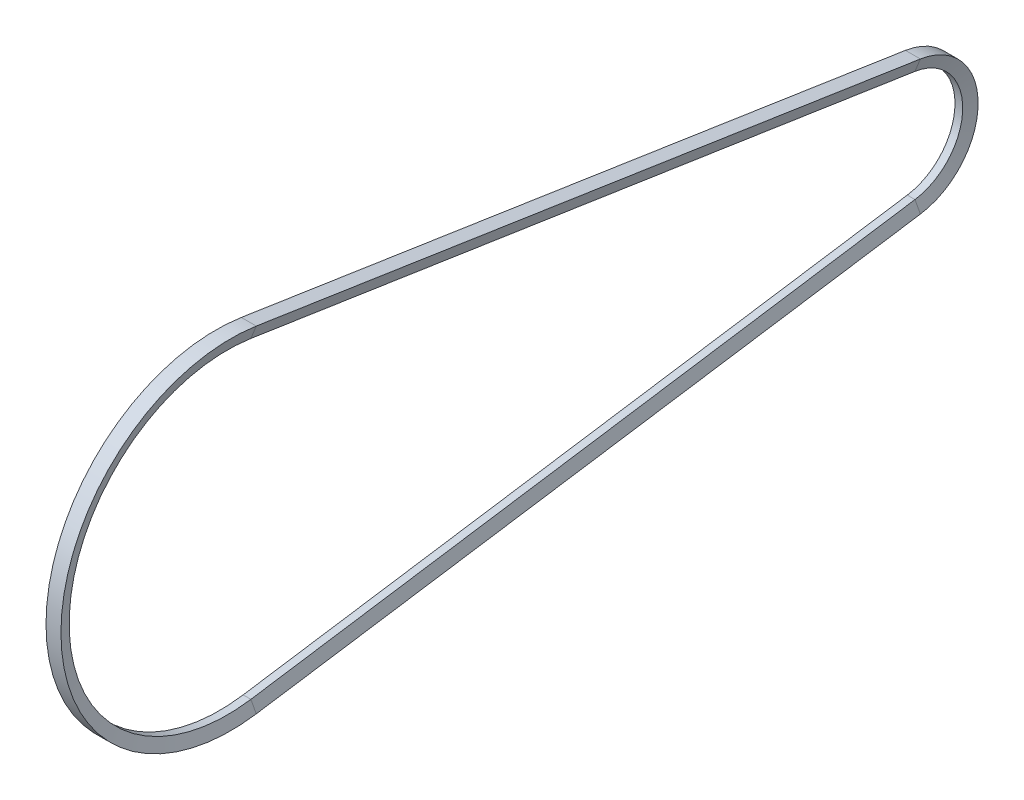
ISO-10303-21;
HEADER;
FILE_DESCRIPTION(('STEP AP214'),'2;1');
FILE_NAME('part.step','',(''),(''),'','','');
FILE_SCHEMA(('AUTOMOTIVE_DESIGN { 1 0 10303 214 1 1 1 1 }'));
ENDSEC;
DATA;
#1=APPLICATION_CONTEXT('core data for automotive mechanical design processes');
#2=APPLICATION_PROTOCOL_DEFINITION('international standard','automotive_design',2000,#1);
#3=PRODUCT_CONTEXT('',#1,'mechanical');
#4=PRODUCT('Part','Part','',(#3));
#5=PRODUCT_RELATED_PRODUCT_CATEGORY('part','',(#4));
#6=PRODUCT_DEFINITION_FORMATION('','',#4);
#7=PRODUCT_DEFINITION_CONTEXT('part definition',#1,'design');
#8=PRODUCT_DEFINITION('design','',#6,#7);
#9=PRODUCT_DEFINITION_SHAPE('','',#8);
#10=(LENGTH_UNIT() NAMED_UNIT(*) SI_UNIT(.MILLI.,.METRE.));
#11=(NAMED_UNIT(*) PLANE_ANGLE_UNIT() SI_UNIT($,.RADIAN.));
#12=(NAMED_UNIT(*) SI_UNIT($,.STERADIAN.) SOLID_ANGLE_UNIT());
#13=UNCERTAINTY_MEASURE_WITH_UNIT(LENGTH_MEASURE(1.E-05),#10,'distance_accuracy_value','');
#14=(GEOMETRIC_REPRESENTATION_CONTEXT(3) GLOBAL_UNCERTAINTY_ASSIGNED_CONTEXT((#13)) GLOBAL_UNIT_ASSIGNED_CONTEXT((#10,
#11,#12)) REPRESENTATION_CONTEXT('',''));
#15=CARTESIAN_POINT('',(0.,0.,0.));
#16=DIRECTION('',(0.,0.,1.));
#17=DIRECTION('',(1.,0.,0.));
#18=AXIS2_PLACEMENT_3D('',#15,#16,#17);
#19=CARTESIAN_POINT('',(2.84014307130969,40.8327316622341,-506.194999999998));
#20=DIRECTION('',(0.,-0.988685996664259,0.15));
#21=DIRECTION('',(0.,-0.15,-0.988685996664259));
#22=AXIS2_PLACEMENT_3D('',#19,#20,#21);
#23=PLANE('',#22);
#24=DIRECTION('',(1.,0.,0.));
#25=VECTOR('',#24,1.);
#26=CARTESIAN_POINT('',(2.84014307130969,40.8327316622341,-506.194999999998));
#27=LINE('',#26,#25);
#28=CARTESIAN_POINT('',(-2.84014307130969,40.8327316622341,-506.194999999998));
#29=VERTEX_POINT('',#28);
#30=CARTESIAN_POINT('',(2.84014307130969,40.8327316622341,-506.194999999998));
#31=VERTEX_POINT('',#30);
#32=EDGE_CURVE('E157',#29,#31,#27,.T.);
#33=ORIENTED_EDGE('',*,*,#32,.T.);
#34=DIRECTION('',(0.,0.15,0.988685996664259));
#35=VECTOR('',#34,1.);
#36=CARTESIAN_POINT('',(2.84014307130969,40.8327316622341,-506.194999999998));
#37=LINE('',#36,#35);
#38=CARTESIAN_POINT('',(2.84014307130969,114.984181412054,-17.4449999999985));
#39=VERTEX_POINT('',#38);
#40=EDGE_CURVE('E38',#31,#39,#37,.T.);
#41=ORIENTED_EDGE('',*,*,#40,.T.);
#42=DIRECTION('',(1.,0.,0.));
#43=VECTOR('',#42,1.);
#44=CARTESIAN_POINT('',(2.84014307130969,114.984181412054,-17.4449999999985));
#45=LINE('',#44,#43);
#46=CARTESIAN_POINT('',(-2.84014307130969,114.984181412054,-17.4449999999985));
#47=VERTEX_POINT('',#46);
#48=EDGE_CURVE('E178',#47,#39,#45,.T.);
#49=ORIENTED_EDGE('',*,*,#48,.F.);
#50=DIRECTION('',(0.,0.15,0.988685996664259));
#51=VECTOR('',#50,1.);
#52=CARTESIAN_POINT('',(-2.84014307130969,40.8327316622341,-506.194999999998));
#53=LINE('',#52,#51);
#54=EDGE_CURVE('E11',#29,#47,#53,.T.);
#55=ORIENTED_EDGE('',*,*,#54,.F.);
#56=EDGE_LOOP('',(#33,#41,#49,#55));
#57=FACE_BOUND('',#56,.T.);
#58=ADVANCED_FACE('F30',(#57),#23,.T.);
#59=CARTESIAN_POINT('',(5.5,49.4342998332132,-507.499999999998));
#60=DIRECTION('',(0.956304755963036,-0.289063810280224,0.04385575570841));
#61=DIRECTION('',(0.289342194072153,0.95722572820078,0.));
#62=AXIS2_PLACEMENT_3D('',#59,#60,#61);
#63=PLANE('',#62);
#64=DIRECTION('',(0.292371704722734,0.945485120764089,-0.143445713394439));
#65=VECTOR('',#64,1.);
#66=CARTESIAN_POINT('',(5.5,49.4342998332132,-507.499999999998));
#67=LINE('',#66,#65);
#68=CARTESIAN_POINT('',(5.5,49.4342998332132,-507.499999999998));
#69=VERTEX_POINT('',#68);
#70=EDGE_CURVE('E154',#31,#69,#67,.T.);
#71=ORIENTED_EDGE('',*,*,#70,.T.);
#72=DIRECTION('',(0.,0.15,0.988685996664259));
#73=VECTOR('',#72,1.);
#74=CARTESIAN_POINT('',(5.5,49.4342998332132,-507.499999999998));
#75=LINE('',#74,#73);
#76=CARTESIAN_POINT('',(5.5,123.585749583033,-18.7499999999983));
#77=VERTEX_POINT('',#76);
#78=EDGE_CURVE('E183',#69,#77,#75,.T.);
#79=ORIENTED_EDGE('',*,*,#78,.T.);
#80=DIRECTION('',(0.292371704722734,0.945485120764089,-0.143445713394439));
#81=VECTOR('',#80,1.);
#82=CARTESIAN_POINT('',(5.5,123.585749583033,-18.7499999999983));
#83=LINE('',#82,#81);
#84=EDGE_CURVE('E176',#39,#77,#83,.T.);
#85=ORIENTED_EDGE('',*,*,#84,.F.);
#86=ORIENTED_EDGE('',*,*,#40,.F.);
#87=EDGE_LOOP('',(#71,#79,#85,#86));
#88=FACE_BOUND('',#87,.T.);
#89=ADVANCED_FACE('F207',(#88),#63,.T.);
#90=CARTESIAN_POINT('',(-5.5,49.4342998332132,-507.499999999998));
#91=DIRECTION('',(0.,0.988685996664259,-0.15));
#92=DIRECTION('',(0.,0.15,0.988685996664259));
#93=AXIS2_PLACEMENT_3D('',#90,#91,#92);
#94=PLANE('',#93);
#95=DIRECTION('',(-1.,0.,0.));
#96=VECTOR('',#95,1.);
#97=CARTESIAN_POINT('',(-5.5,49.4342998332132,-507.499999999998));
#98=LINE('',#97,#96);
#99=CARTESIAN_POINT('',(-5.5,49.4342998332132,-507.499999999998));
#100=VERTEX_POINT('',#99);
#101=EDGE_CURVE('E151',#69,#100,#98,.T.);
#102=ORIENTED_EDGE('',*,*,#101,.T.);
#103=DIRECTION('',(0.,0.15,0.988685996664259));
#104=VECTOR('',#103,1.);
#105=CARTESIAN_POINT('',(-5.5,49.4342998332132,-507.499999999998));
#106=LINE('',#105,#104);
#107=CARTESIAN_POINT('',(-5.5,123.585749583033,-18.7499999999983));
#108=VERTEX_POINT('',#107);
#109=EDGE_CURVE('E180',#100,#108,#106,.T.);
#110=ORIENTED_EDGE('',*,*,#109,.T.);
#111=DIRECTION('',(-1.,0.,0.));
#112=VECTOR('',#111,1.);
#113=CARTESIAN_POINT('',(-5.5,123.585749583033,-18.7499999999983));
#114=LINE('',#113,#112);
#115=EDGE_CURVE('E173',#77,#108,#114,.T.);
#116=ORIENTED_EDGE('',*,*,#115,.F.);
#117=ORIENTED_EDGE('',*,*,#78,.F.);
#118=EDGE_LOOP('',(#102,#110,#116,#117));
#119=FACE_BOUND('',#118,.T.);
#120=ADVANCED_FACE('F206',(#119),#94,.T.);
#121=CARTESIAN_POINT('',(-2.84014307130969,40.8327316622341,-506.194999999998));
#122=DIRECTION('',(-0.956304755963036,-0.289063810280224,0.04385575570841));
#123=DIRECTION('',(0.289342194072153,-0.95722572820078,0.));
#124=AXIS2_PLACEMENT_3D('',#121,#122,#123);
#125=PLANE('',#124);
#126=DIRECTION('',(0.292371704722734,-0.945485120764089,0.143445713394439));
#127=VECTOR('',#126,1.);
#128=CARTESIAN_POINT('',(-2.84014307130969,40.8327316622341,-506.194999999998));
#129=LINE('',#128,#127);
#130=EDGE_CURVE('E109',#100,#29,#129,.T.);
#131=ORIENTED_EDGE('',*,*,#130,.T.);
#132=ORIENTED_EDGE('',*,*,#54,.T.);
#133=DIRECTION('',(0.292371704722734,-0.945485120764089,0.143445713394439));
#134=VECTOR('',#133,1.);
#135=CARTESIAN_POINT('',(-2.84014307130969,114.984181412054,-17.4449999999985));
#136=LINE('',#135,#134);
#137=EDGE_CURVE('E122',#108,#47,#136,.T.);
#138=ORIENTED_EDGE('',*,*,#137,.F.);
#139=ORIENTED_EDGE('',*,*,#109,.F.);
#140=EDGE_LOOP('',(#131,#132,#138,#139));
#141=FACE_BOUND('',#140,.T.);
#142=ADVANCED_FACE('F240',(#141),#125,.T.);
#143=CARTESIAN_POINT('',(0.,0.,-500.));
#144=DIRECTION('',(1.,0.,0.));
#145=DIRECTION('',(0.,0.,-1.));
#146=AXIS2_PLACEMENT_3D('',#143,#144,#145);
#147=CYLINDRICAL_SURFACE('',#146,41.2999999999999);
#148=DIRECTION('',(1.,0.,0.));
#149=VECTOR('',#148,1.);
#150=CARTESIAN_POINT('',(2.84014307130969,-40.8327316622336,-506.195000000002));
#151=LINE('',#150,#149);
#152=CARTESIAN_POINT('',(-2.84014307130969,-40.8327316622336,-506.195000000002));
#153=VERTEX_POINT('',#152);
#154=CARTESIAN_POINT('',(2.84014307130969,-40.8327316622336,-506.195000000002));
#155=VERTEX_POINT('',#154);
#156=EDGE_CURVE('E106',#153,#155,#151,.T.);
#157=ORIENTED_EDGE('',*,*,#156,.T.);
#158=CARTESIAN_POINT('',(2.84014307130969,0.,-500.));
#159=DIRECTION('',(1.,0.,0.));
#160=DIRECTION('',(0.,0.,-1.));
#161=AXIS2_PLACEMENT_3D('',#158,#159,#160);
#162=CIRCLE('',#161,41.2999999999999);
#163=EDGE_CURVE('E166',#155,#31,#162,.T.);
#164=ORIENTED_EDGE('',*,*,#163,.T.);
#165=ORIENTED_EDGE('',*,*,#32,.F.);
#166=CARTESIAN_POINT('',(-2.84014307130969,0.,-500.));
#167=DIRECTION('',(1.,0.,0.));
#168=DIRECTION('',(0.,0.,-1.));
#169=AXIS2_PLACEMENT_3D('',#166,#167,#168);
#170=CIRCLE('',#169,41.2999999999999);
#171=EDGE_CURVE('E169',#153,#29,#170,.T.);
#172=ORIENTED_EDGE('',*,*,#171,.F.);
#173=EDGE_LOOP('',(#157,#164,#165,#172));
#174=FACE_BOUND('',#173,.T.);
#175=ADVANCED_FACE('F237',(#174),#147,.F.);
#176=CARTESIAN_POINT('',(2.84014307130969,0.,-500.));
#177=DIRECTION('',(1.,0.,0.));
#178=DIRECTION('',(0.,0.,-1.));
#179=AXIS2_PLACEMENT_3D('',#176,#177,#178);
#180=CONICAL_SURFACE('',#179,41.2999999999999,1.27409035395586);
#181=DIRECTION('',(0.292371704722734,-0.945485120764084,-0.143445713394468));
#182=VECTOR('',#181,1.);
#183=CARTESIAN_POINT('',(5.5,-49.4342998332127,-507.500000000002));
#184=LINE('',#183,#182);
#185=CARTESIAN_POINT('',(5.5,-49.4342998332127,-507.500000000002));
#186=VERTEX_POINT('',#185);
#187=EDGE_CURVE('E140',#155,#186,#184,.T.);
#188=ORIENTED_EDGE('',*,*,#187,.T.);
#189=CARTESIAN_POINT('',(5.5,0.,-500.));
#190=DIRECTION('',(1.,0.,0.));
#191=DIRECTION('',(0.,0.,-1.));
#192=AXIS2_PLACEMENT_3D('',#189,#190,#191);
#193=CIRCLE('',#192,49.9999999999999);
#194=EDGE_CURVE('E163',#186,#69,#193,.T.);
#195=ORIENTED_EDGE('',*,*,#194,.T.);
#196=ORIENTED_EDGE('',*,*,#70,.F.);
#197=ORIENTED_EDGE('',*,*,#163,.F.);
#198=EDGE_LOOP('',(#188,#195,#196,#197));
#199=FACE_BOUND('',#198,.T.);
#200=ADVANCED_FACE('F214',(#199),#180,.F.);
#201=CARTESIAN_POINT('',(0.,0.,-500.));
#202=DIRECTION('',(1.,0.,0.));
#203=DIRECTION('',(0.,0.,-1.));
#204=AXIS2_PLACEMENT_3D('',#201,#202,#203);
#205=CYLINDRICAL_SURFACE('',#204,49.9999999999999);
#206=DIRECTION('',(-1.,0.,0.));
#207=VECTOR('',#206,1.);
#208=CARTESIAN_POINT('',(-5.5,-49.4342998332127,-507.500000000002));
#209=LINE('',#208,#207);
#210=CARTESIAN_POINT('',(-5.5,-49.4342998332127,-507.500000000002));
#211=VERTEX_POINT('',#210);
#212=EDGE_CURVE('E136',#186,#211,#209,.T.);
#213=ORIENTED_EDGE('',*,*,#212,.T.);
#214=CARTESIAN_POINT('',(-5.5,0.,-500.));
#215=DIRECTION('',(1.,0.,0.));
#216=DIRECTION('',(0.,0.,-1.));
#217=AXIS2_PLACEMENT_3D('',#214,#215,#216);
#218=CIRCLE('',#217,49.9999999999999);
#219=EDGE_CURVE('E160',#211,#100,#218,.T.);
#220=ORIENTED_EDGE('',*,*,#219,.T.);
#221=ORIENTED_EDGE('',*,*,#101,.F.);
#222=ORIENTED_EDGE('',*,*,#194,.F.);
#223=EDGE_LOOP('',(#213,#220,#221,#222));
#224=FACE_BOUND('',#223,.T.);
#225=ADVANCED_FACE('F212',(#224),#205,.T.);
#226=CARTESIAN_POINT('',(-5.5,0.,-500.));
#227=DIRECTION('',(-1.,0.,0.));
#228=DIRECTION('',(0.,0.,1.));
#229=AXIS2_PLACEMENT_3D('',#226,#227,#228);
#230=CONICAL_SURFACE('',#229,49.9999999999999,1.27409035395586);
#231=DIRECTION('',(0.292371704722734,0.945485120764084,0.143445713394468));
#232=VECTOR('',#231,1.);
#233=CARTESIAN_POINT('',(-2.84014307130969,-40.8327316622336,-506.195000000002));
#234=LINE('',#233,#232);
#235=EDGE_CURVE('E133',#211,#153,#234,.T.);
#236=ORIENTED_EDGE('',*,*,#235,.T.);
#237=ORIENTED_EDGE('',*,*,#171,.T.);
#238=ORIENTED_EDGE('',*,*,#130,.F.);
#239=ORIENTED_EDGE('',*,*,#219,.F.);
#240=EDGE_LOOP('',(#236,#237,#238,#239));
#241=FACE_BOUND('',#240,.T.);
#242=ADVANCED_FACE('F228',(#241),#230,.F.);
#243=CARTESIAN_POINT('',(2.84014307130969,-114.984181412053,-17.4450000000016));
#244=DIRECTION('',(0.,0.988685996664259,0.15));
#245=DIRECTION('',(0.,-0.15,0.988685996664259));
#246=AXIS2_PLACEMENT_3D('',#243,#244,#245);
#247=PLANE('',#246);
#248=DIRECTION('',(1.,0.,0.));
#249=VECTOR('',#248,1.);
#250=CARTESIAN_POINT('',(2.84014307130969,-114.984181412053,-17.4450000000016));
#251=LINE('',#250,#249);
#252=CARTESIAN_POINT('',(-2.84014307130969,-114.984181412053,-17.4450000000016));
#253=VERTEX_POINT('',#252);
#254=CARTESIAN_POINT('',(2.84014307130969,-114.984181412053,-17.4450000000016));
#255=VERTEX_POINT('',#254);
#256=EDGE_CURVE('E104',#253,#255,#251,.T.);
#257=ORIENTED_EDGE('',*,*,#256,.T.);
#258=DIRECTION('',(0.,0.15,-0.988685996664259));
#259=VECTOR('',#258,1.);
#260=CARTESIAN_POINT('',(2.84014307130969,-114.984181412053,-17.4450000000016));
#261=LINE('',#260,#259);
#262=EDGE_CURVE('E110',#255,#155,#261,.T.);
#263=ORIENTED_EDGE('',*,*,#262,.T.);
#264=ORIENTED_EDGE('',*,*,#156,.F.);
#265=DIRECTION('',(0.,0.15,-0.988685996664259));
#266=VECTOR('',#265,1.);
#267=CARTESIAN_POINT('',(-2.84014307130969,-114.984181412053,-17.4450000000016));
#268=LINE('',#267,#266);
#269=EDGE_CURVE('E100',#253,#153,#268,.T.);
#270=ORIENTED_EDGE('',*,*,#269,.F.);
#271=EDGE_LOOP('',(#257,#263,#264,#270));
#272=FACE_BOUND('',#271,.T.);
#273=ADVANCED_FACE('F102',(#272),#247,.T.);
#274=CARTESIAN_POINT('',(5.5,-123.585749583032,-18.7500000000017));
#275=DIRECTION('',(0.956304755963036,0.289063810280224,0.04385575570841));
#276=DIRECTION('',(-0.289342194072153,0.957225728200779,0.));
#277=AXIS2_PLACEMENT_3D('',#274,#275,#276);
#278=PLANE('',#277);
#279=DIRECTION('',(0.292371704722734,-0.945485120764084,-0.143445713394468));
#280=VECTOR('',#279,1.);
#281=CARTESIAN_POINT('',(5.5,-123.585749583032,-18.7500000000017));
#282=LINE('',#281,#280);
#283=CARTESIAN_POINT('',(5.5,-123.585749583032,-18.7500000000017));
#284=VERTEX_POINT('',#283);
#285=EDGE_CURVE('E127',#255,#284,#282,.T.);
#286=ORIENTED_EDGE('',*,*,#285,.T.);
#287=DIRECTION('',(0.,0.15,-0.988685996664259));
#288=VECTOR('',#287,1.);
#289=CARTESIAN_POINT('',(5.5,-123.585749583032,-18.7500000000017));
#290=LINE('',#289,#288);
#291=EDGE_CURVE('E145',#284,#186,#290,.T.);
#292=ORIENTED_EDGE('',*,*,#291,.T.);
#293=ORIENTED_EDGE('',*,*,#187,.F.);
#294=ORIENTED_EDGE('',*,*,#262,.F.);
#295=EDGE_LOOP('',(#286,#292,#293,#294));
#296=FACE_BOUND('',#295,.T.);
#297=ADVANCED_FACE('F220',(#296),#278,.T.);
#298=CARTESIAN_POINT('',(-5.5,-123.585749583032,-18.7500000000017));
#299=DIRECTION('',(0.,-0.988685996664259,-0.15));
#300=DIRECTION('',(0.,0.15,-0.988685996664259));
#301=AXIS2_PLACEMENT_3D('',#298,#299,#300);
#302=PLANE('',#301);
#303=DIRECTION('',(-1.,0.,0.));
#304=VECTOR('',#303,1.);
#305=CARTESIAN_POINT('',(-5.5,-123.585749583032,-18.7500000000017));
#306=LINE('',#305,#304);
#307=CARTESIAN_POINT('',(-5.5,-123.585749583032,-18.7500000000017));
#308=VERTEX_POINT('',#307);
#309=EDGE_CURVE('E124',#284,#308,#306,.T.);
#310=ORIENTED_EDGE('',*,*,#309,.T.);
#311=DIRECTION('',(0.,0.15,-0.988685996664259));
#312=VECTOR('',#311,1.);
#313=CARTESIAN_POINT('',(-5.5,-123.585749583032,-18.7500000000017));
#314=LINE('',#313,#312);
#315=EDGE_CURVE('E116',#308,#211,#314,.T.);
#316=ORIENTED_EDGE('',*,*,#315,.T.);
#317=ORIENTED_EDGE('',*,*,#212,.F.);
#318=ORIENTED_EDGE('',*,*,#291,.F.);
#319=EDGE_LOOP('',(#310,#316,#317,#318));
#320=FACE_BOUND('',#319,.T.);
#321=ADVANCED_FACE('F219',(#320),#302,.T.);
#322=CARTESIAN_POINT('',(-2.84014307130969,-114.984181412053,-17.4450000000016));
#323=DIRECTION('',(-0.956304755963036,0.289063810280224,0.04385575570841));
#324=DIRECTION('',(-0.289342194072153,-0.957225728200779,0.));
#325=AXIS2_PLACEMENT_3D('',#322,#323,#324);
#326=PLANE('',#325);
#327=DIRECTION('',(0.292371704722734,0.945485120764084,0.143445713394468));
#328=VECTOR('',#327,1.);
#329=CARTESIAN_POINT('',(-2.84014307130969,-114.984181412053,-17.4450000000016));
#330=LINE('',#329,#328);
#331=EDGE_CURVE('E113',#308,#253,#330,.T.);
#332=ORIENTED_EDGE('',*,*,#331,.T.);
#333=ORIENTED_EDGE('',*,*,#269,.T.);
#334=ORIENTED_EDGE('',*,*,#235,.F.);
#335=ORIENTED_EDGE('',*,*,#315,.F.);
#336=EDGE_LOOP('',(#332,#333,#334,#335));
#337=FACE_BOUND('',#336,.T.);
#338=ADVANCED_FACE('F114',(#337),#326,.T.);
#339=CARTESIAN_POINT('',(-5.5,0.,0.));
#340=DIRECTION('',(-1.,0.,0.));
#341=DIRECTION('',(0.,0.,1.));
#342=AXIS2_PLACEMENT_3D('',#339,#340,#341);
#343=CONICAL_SURFACE('',#342,125.,1.27409035395586);
#344=CARTESIAN_POINT('',(-5.5,0.,0.));
#345=DIRECTION('',(-1.,0.,0.));
#346=DIRECTION('',(0.,0.,1.));
#347=AXIS2_PLACEMENT_3D('',#344,#345,#346);
#348=CIRCLE('',#347,125.);
#349=EDGE_CURVE('E137',#308,#108,#348,.T.);
#350=ORIENTED_EDGE('',*,*,#349,.T.);
#351=ORIENTED_EDGE('',*,*,#137,.T.);
#352=CARTESIAN_POINT('',(-2.84014307130969,0.,0.));
#353=DIRECTION('',(-1.,0.,0.));
#354=DIRECTION('',(0.,0.,1.));
#355=AXIS2_PLACEMENT_3D('',#352,#353,#354);
#356=CIRCLE('',#355,116.3);
#357=EDGE_CURVE('E46',#253,#47,#356,.T.);
#358=ORIENTED_EDGE('',*,*,#357,.F.);
#359=ORIENTED_EDGE('',*,*,#331,.F.);
#360=EDGE_LOOP('',(#350,#351,#358,#359));
#361=FACE_BOUND('',#360,.T.);
#362=ADVANCED_FACE('F120',(#361),#343,.F.);
#363=CARTESIAN_POINT('',(0.,0.,0.));
#364=DIRECTION('',(-1.,0.,0.));
#365=DIRECTION('',(0.,0.,1.));
#366=AXIS2_PLACEMENT_3D('',#363,#364,#365);
#367=CYLINDRICAL_SURFACE('',#366,125.);
#368=CARTESIAN_POINT('',(5.5,0.,0.));
#369=DIRECTION('',(-1.,0.,0.));
#370=DIRECTION('',(0.,0.,1.));
#371=AXIS2_PLACEMENT_3D('',#368,#369,#370);
#372=CIRCLE('',#371,125.);
#373=EDGE_CURVE('E191',#284,#77,#372,.T.);
#374=ORIENTED_EDGE('',*,*,#373,.T.);
#375=ORIENTED_EDGE('',*,*,#115,.T.);
#376=ORIENTED_EDGE('',*,*,#349,.F.);
#377=ORIENTED_EDGE('',*,*,#309,.F.);
#378=EDGE_LOOP('',(#374,#375,#376,#377));
#379=FACE_BOUND('',#378,.T.);
#380=ADVANCED_FACE('F199',(#379),#367,.T.);
#381=CARTESIAN_POINT('',(2.84014307130969,0.,0.));
#382=DIRECTION('',(1.,0.,0.));
#383=DIRECTION('',(0.,0.,-1.));
#384=AXIS2_PLACEMENT_3D('',#381,#382,#383);
#385=CONICAL_SURFACE('',#384,116.3,1.27409035395586);
#386=CARTESIAN_POINT('',(2.84014307130969,0.,0.));
#387=DIRECTION('',(-1.,0.,0.));
#388=DIRECTION('',(0.,0.,1.));
#389=AXIS2_PLACEMENT_3D('',#386,#387,#388);
#390=CIRCLE('',#389,116.3);
#391=EDGE_CURVE('E54',#255,#39,#390,.T.);
#392=ORIENTED_EDGE('',*,*,#391,.T.);
#393=ORIENTED_EDGE('',*,*,#84,.T.);
#394=ORIENTED_EDGE('',*,*,#373,.F.);
#395=ORIENTED_EDGE('',*,*,#285,.F.);
#396=EDGE_LOOP('',(#392,#393,#394,#395));
#397=FACE_BOUND('',#396,.T.);
#398=ADVANCED_FACE('F203',(#397),#385,.F.);
#399=CARTESIAN_POINT('',(0.,0.,0.));
#400=DIRECTION('',(-1.,0.,0.));
#401=DIRECTION('',(0.,0.,1.));
#402=AXIS2_PLACEMENT_3D('',#399,#400,#401);
#403=CYLINDRICAL_SURFACE('',#402,116.3);
#404=ORIENTED_EDGE('',*,*,#256,.F.);
#405=ORIENTED_EDGE('',*,*,#357,.T.);
#406=ORIENTED_EDGE('',*,*,#48,.T.);
#407=ORIENTED_EDGE('',*,*,#391,.F.);
#408=EDGE_LOOP('',(#404,#405,#406,#407));
#409=FACE_BOUND('',#408,.T.);
#410=ADVANCED_FACE('F126',(#409),#403,.F.);
#411=CLOSED_SHELL('',(#58,#89,#120,#142,#175,#200,#225,#242,#273,#297,#321,#338,#362,#380,#398,#410));
#412=MANIFOLD_SOLID_BREP('B2',#411);
#413=ADVANCED_BREP_SHAPE_REPRESENTATION('',(#18,#412),#14);
#414=SHAPE_DEFINITION_REPRESENTATION(#9,#413);
ENDSEC;
END-ISO-10303-21;
